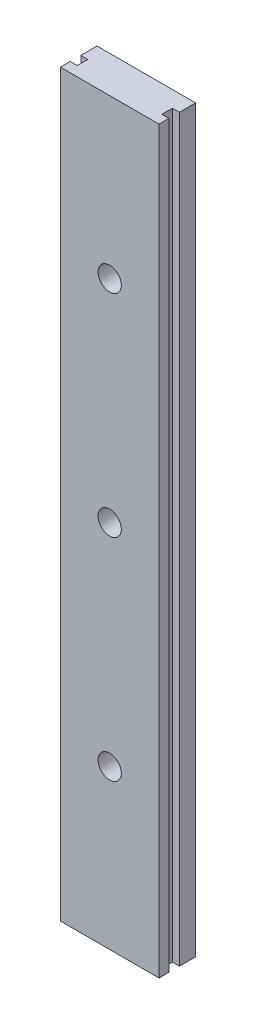
ISO-10303-21;
HEADER;
FILE_DESCRIPTION(('STEP AP214'),'2;1');
FILE_NAME('part.step','',(''),(''),'','','');
FILE_SCHEMA(('AUTOMOTIVE_DESIGN { 1 0 10303 214 1 1 1 1 }'));
ENDSEC;
DATA;
#1=APPLICATION_CONTEXT('core data for automotive mechanical design processes');
#2=APPLICATION_PROTOCOL_DEFINITION('international standard','automotive_design',2000,#1);
#3=PRODUCT_CONTEXT('',#1,'mechanical');
#4=PRODUCT('Part','Part','',(#3));
#5=PRODUCT_RELATED_PRODUCT_CATEGORY('part','',(#4));
#6=PRODUCT_DEFINITION_FORMATION('','',#4);
#7=PRODUCT_DEFINITION_CONTEXT('part definition',#1,'design');
#8=PRODUCT_DEFINITION('design','',#6,#7);
#9=PRODUCT_DEFINITION_SHAPE('','',#8);
#10=(LENGTH_UNIT() NAMED_UNIT(*) SI_UNIT(.MILLI.,.METRE.));
#11=(NAMED_UNIT(*) PLANE_ANGLE_UNIT() SI_UNIT($,.RADIAN.));
#12=(NAMED_UNIT(*) SI_UNIT($,.STERADIAN.) SOLID_ANGLE_UNIT());
#13=UNCERTAINTY_MEASURE_WITH_UNIT(LENGTH_MEASURE(1.E-05),#10,'distance_accuracy_value','');
#14=(GEOMETRIC_REPRESENTATION_CONTEXT(3) GLOBAL_UNCERTAINTY_ASSIGNED_CONTEXT((#13)) GLOBAL_UNIT_ASSIGNED_CONTEXT((#10,
#11,#12)) REPRESENTATION_CONTEXT('',''));
#15=CARTESIAN_POINT('',(0.,0.,0.));
#16=DIRECTION('',(0.,0.,1.));
#17=DIRECTION('',(1.,0.,0.));
#18=AXIS2_PLACEMENT_3D('',#15,#16,#17);
#19=CARTESIAN_POINT('',(0.,105.,0.));
#20=DIRECTION('',(0.,0.,-1.));
#21=DIRECTION('',(-1.,0.,0.));
#22=AXIS2_PLACEMENT_3D('',#19,#20,#21);
#23=PLANE('',#22);
#24=CARTESIAN_POINT('',(7.,22.5,0.));
#25=DIRECTION('',(0.,0.,-1.));
#26=DIRECTION('',(-1.,0.,0.));
#27=AXIS2_PLACEMENT_3D('',#24,#25,#26);
#28=CIRCLE('',#27,1.65);
#29=CARTESIAN_POINT('',(5.35,22.5,0.));
#30=VERTEX_POINT('',#29);
#31=EDGE_CURVE('E266',#30,#30,#28,.T.);
#32=ORIENTED_EDGE('',*,*,#31,.T.);
#33=EDGE_LOOP('',(#32));
#34=FACE_BOUND('',#33,.T.);
#35=CARTESIAN_POINT('',(7.,82.5,0.));
#36=DIRECTION('',(0.,0.,-1.));
#37=DIRECTION('',(-1.,0.,0.));
#38=AXIS2_PLACEMENT_3D('',#35,#36,#37);
#39=CIRCLE('',#38,1.65);
#40=CARTESIAN_POINT('',(5.35,82.5,0.));
#41=VERTEX_POINT('',#40);
#42=EDGE_CURVE('E270',#41,#41,#39,.T.);
#43=ORIENTED_EDGE('',*,*,#42,.T.);
#44=EDGE_LOOP('',(#43));
#45=FACE_BOUND('',#44,.T.);
#46=CARTESIAN_POINT('',(7.,52.5,0.));
#47=DIRECTION('',(0.,0.,-1.));
#48=DIRECTION('',(-1.,0.,0.));
#49=AXIS2_PLACEMENT_3D('',#46,#47,#48);
#50=CIRCLE('',#49,1.65);
#51=CARTESIAN_POINT('',(5.35,52.5,0.));
#52=VERTEX_POINT('',#51);
#53=EDGE_CURVE('E161',#52,#52,#50,.T.);
#54=ORIENTED_EDGE('',*,*,#53,.T.);
#55=EDGE_LOOP('',(#54));
#56=FACE_BOUND('',#55,.T.);
#57=DIRECTION('',(1.,0.,0.));
#58=VECTOR('',#57,1.);
#59=CARTESIAN_POINT('',(0.,0.,0.));
#60=LINE('',#59,#58);
#61=CARTESIAN_POINT('',(0.,0.,0.));
#62=VERTEX_POINT('',#61);
#63=CARTESIAN_POINT('',(14.,0.,0.));
#64=VERTEX_POINT('',#63);
#65=EDGE_CURVE('E157',#62,#64,#60,.T.);
#66=ORIENTED_EDGE('',*,*,#65,.T.);
#67=DIRECTION('',(0.,-1.,0.));
#68=VECTOR('',#67,1.);
#69=CARTESIAN_POINT('',(14.,105.,0.));
#70=LINE('',#69,#68);
#71=CARTESIAN_POINT('',(14.,105.,0.));
#72=VERTEX_POINT('',#71);
#73=EDGE_CURVE('E11',#72,#64,#70,.T.);
#74=ORIENTED_EDGE('',*,*,#73,.F.);
#75=DIRECTION('',(1.,0.,0.));
#76=VECTOR('',#75,1.);
#77=CARTESIAN_POINT('',(0.,105.,0.));
#78=LINE('',#77,#76);
#79=CARTESIAN_POINT('',(0.,105.,0.));
#80=VERTEX_POINT('',#79);
#81=EDGE_CURVE('E180',#80,#72,#78,.T.);
#82=ORIENTED_EDGE('',*,*,#81,.F.);
#83=DIRECTION('',(0.,-1.,0.));
#84=VECTOR('',#83,1.);
#85=CARTESIAN_POINT('',(0.,105.,0.));
#86=LINE('',#85,#84);
#87=EDGE_CURVE('E153',#80,#62,#86,.T.);
#88=ORIENTED_EDGE('',*,*,#87,.T.);
#89=EDGE_LOOP('',(#66,#74,#82,#88));
#90=FACE_BOUND('',#89,.T.);
#91=ADVANCED_FACE('F37',(#34,#45,#56,#90),#23,.F.);
#92=CARTESIAN_POINT('',(14.,105.,0.));
#93=DIRECTION('',(-1.,0.,0.));
#94=DIRECTION('',(0.,0.,1.));
#95=AXIS2_PLACEMENT_3D('',#92,#93,#94);
#96=PLANE('',#95);
#97=DIRECTION('',(0.,0.,-1.));
#98=VECTOR('',#97,1.);
#99=CARTESIAN_POINT('',(14.,0.,0.));
#100=LINE('',#99,#98);
#101=CARTESIAN_POINT('',(14.,0.,-1.4));
#102=VERTEX_POINT('',#101);
#103=EDGE_CURVE('E160',#64,#102,#100,.T.);
#104=ORIENTED_EDGE('',*,*,#103,.T.);
#105=DIRECTION('',(0.,-1.,0.));
#106=VECTOR('',#105,1.);
#107=CARTESIAN_POINT('',(14.,105.,-1.4));
#108=LINE('',#107,#106);
#109=CARTESIAN_POINT('',(14.,105.,-1.4));
#110=VERTEX_POINT('',#109);
#111=EDGE_CURVE('E45',#110,#102,#108,.T.);
#112=ORIENTED_EDGE('',*,*,#111,.F.);
#113=DIRECTION('',(0.,0.,-1.));
#114=VECTOR('',#113,1.);
#115=CARTESIAN_POINT('',(14.,105.,0.));
#116=LINE('',#115,#114);
#117=EDGE_CURVE('E108',#72,#110,#116,.T.);
#118=ORIENTED_EDGE('',*,*,#117,.F.);
#119=ORIENTED_EDGE('',*,*,#73,.T.);
#120=EDGE_LOOP('',(#104,#112,#118,#119));
#121=FACE_BOUND('',#120,.T.);
#122=ADVANCED_FACE('F258',(#121),#96,.F.);
#123=CARTESIAN_POINT('',(14.,105.,-1.4));
#124=DIRECTION('',(0.,0.,1.));
#125=DIRECTION('',(1.,0.,0.));
#126=AXIS2_PLACEMENT_3D('',#123,#124,#125);
#127=PLANE('',#126);
#128=DIRECTION('',(-1.,0.,0.));
#129=VECTOR('',#128,1.);
#130=CARTESIAN_POINT('',(14.,0.,-1.4));
#131=LINE('',#130,#129);
#132=CARTESIAN_POINT('',(13.,0.,-1.4));
#133=VERTEX_POINT('',#132);
#134=EDGE_CURVE('E163',#102,#133,#131,.T.);
#135=ORIENTED_EDGE('',*,*,#134,.T.);
#136=DIRECTION('',(0.,-1.,0.));
#137=VECTOR('',#136,1.);
#138=CARTESIAN_POINT('',(13.,105.,-1.4));
#139=LINE('',#138,#137);
#140=CARTESIAN_POINT('',(13.,105.,-1.4));
#141=VERTEX_POINT('',#140);
#142=EDGE_CURVE('E199',#141,#133,#139,.T.);
#143=ORIENTED_EDGE('',*,*,#142,.F.);
#144=DIRECTION('',(-1.,0.,0.));
#145=VECTOR('',#144,1.);
#146=CARTESIAN_POINT('',(14.,105.,-1.4));
#147=LINE('',#146,#145);
#148=EDGE_CURVE('E207',#110,#141,#147,.T.);
#149=ORIENTED_EDGE('',*,*,#148,.F.);
#150=ORIENTED_EDGE('',*,*,#111,.T.);
#151=EDGE_LOOP('',(#135,#143,#149,#150));
#152=FACE_BOUND('',#151,.T.);
#153=ADVANCED_FACE('F205',(#152),#127,.F.);
#154=CARTESIAN_POINT('',(13.,105.,-1.4));
#155=DIRECTION('',(-1.,0.,0.));
#156=DIRECTION('',(0.,0.,1.));
#157=AXIS2_PLACEMENT_3D('',#154,#155,#156);
#158=PLANE('',#157);
#159=DIRECTION('',(0.,0.,-1.));
#160=VECTOR('',#159,1.);
#161=CARTESIAN_POINT('',(13.,0.,-1.4));
#162=LINE('',#161,#160);
#163=CARTESIAN_POINT('',(13.,0.,-2.9));
#164=VERTEX_POINT('',#163);
#165=EDGE_CURVE('E165',#133,#164,#162,.T.);
#166=ORIENTED_EDGE('',*,*,#165,.T.);
#167=DIRECTION('',(0.,-1.,0.));
#168=VECTOR('',#167,1.);
#169=CARTESIAN_POINT('',(13.,105.,-2.9));
#170=LINE('',#169,#168);
#171=CARTESIAN_POINT('',(13.,105.,-2.9));
#172=VERTEX_POINT('',#171);
#173=EDGE_CURVE('E196',#172,#164,#170,.T.);
#174=ORIENTED_EDGE('',*,*,#173,.F.);
#175=DIRECTION('',(0.,0.,-1.));
#176=VECTOR('',#175,1.);
#177=CARTESIAN_POINT('',(13.,105.,-1.4));
#178=LINE('',#177,#176);
#179=EDGE_CURVE('E225',#141,#172,#178,.T.);
#180=ORIENTED_EDGE('',*,*,#179,.F.);
#181=ORIENTED_EDGE('',*,*,#142,.T.);
#182=EDGE_LOOP('',(#166,#174,#180,#181));
#183=FACE_BOUND('',#182,.T.);
#184=ADVANCED_FACE('F216',(#183),#158,.F.);
#185=CARTESIAN_POINT('',(13.,105.,-2.9));
#186=DIRECTION('',(0.,0.,-1.));
#187=DIRECTION('',(-1.,0.,0.));
#188=AXIS2_PLACEMENT_3D('',#185,#186,#187);
#189=PLANE('',#188);
#190=DIRECTION('',(1.,0.,0.));
#191=VECTOR('',#190,1.);
#192=CARTESIAN_POINT('',(13.,0.,-2.9));
#193=LINE('',#192,#191);
#194=CARTESIAN_POINT('',(14.,0.,-2.9));
#195=VERTEX_POINT('',#194);
#196=EDGE_CURVE('E167',#164,#195,#193,.T.);
#197=ORIENTED_EDGE('',*,*,#196,.T.);
#198=DIRECTION('',(0.,-1.,0.));
#199=VECTOR('',#198,1.);
#200=CARTESIAN_POINT('',(14.,105.,-2.9));
#201=LINE('',#200,#199);
#202=CARTESIAN_POINT('',(14.,105.,-2.9));
#203=VERTEX_POINT('',#202);
#204=EDGE_CURVE('E193',#203,#195,#201,.T.);
#205=ORIENTED_EDGE('',*,*,#204,.F.);
#206=DIRECTION('',(1.,0.,0.));
#207=VECTOR('',#206,1.);
#208=CARTESIAN_POINT('',(13.,105.,-2.9));
#209=LINE('',#208,#207);
#210=EDGE_CURVE('E222',#172,#203,#209,.T.);
#211=ORIENTED_EDGE('',*,*,#210,.F.);
#212=ORIENTED_EDGE('',*,*,#173,.T.);
#213=EDGE_LOOP('',(#197,#205,#211,#212));
#214=FACE_BOUND('',#213,.T.);
#215=ADVANCED_FACE('F220',(#214),#189,.F.);
#216=CARTESIAN_POINT('',(14.,105.,-2.9));
#217=DIRECTION('',(-1.,0.,0.));
#218=DIRECTION('',(0.,0.,1.));
#219=AXIS2_PLACEMENT_3D('',#216,#217,#218);
#220=PLANE('',#219);
#221=DIRECTION('',(0.,0.,-1.));
#222=VECTOR('',#221,1.);
#223=CARTESIAN_POINT('',(14.,0.,-2.9));
#224=LINE('',#223,#222);
#225=CARTESIAN_POINT('',(14.,0.,-5.2));
#226=VERTEX_POINT('',#225);
#227=EDGE_CURVE('E169',#195,#226,#224,.T.);
#228=ORIENTED_EDGE('',*,*,#227,.T.);
#229=DIRECTION('',(0.,-1.,0.));
#230=VECTOR('',#229,1.);
#231=CARTESIAN_POINT('',(14.,105.,-5.2));
#232=LINE('',#231,#230);
#233=CARTESIAN_POINT('',(14.,105.,-5.2));
#234=VERTEX_POINT('',#233);
#235=EDGE_CURVE('E190',#234,#226,#232,.T.);
#236=ORIENTED_EDGE('',*,*,#235,.F.);
#237=DIRECTION('',(0.,0.,-1.));
#238=VECTOR('',#237,1.);
#239=CARTESIAN_POINT('',(14.,105.,-2.9));
#240=LINE('',#239,#238);
#241=EDGE_CURVE('E224',#203,#234,#240,.T.);
#242=ORIENTED_EDGE('',*,*,#241,.F.);
#243=ORIENTED_EDGE('',*,*,#204,.T.);
#244=EDGE_LOOP('',(#228,#236,#242,#243));
#245=FACE_BOUND('',#244,.T.);
#246=ADVANCED_FACE('F295',(#245),#220,.F.);
#247=CARTESIAN_POINT('',(0.,105.,-5.2));
#248=DIRECTION('',(0.,0.,1.));
#249=DIRECTION('',(1.,0.,0.));
#250=AXIS2_PLACEMENT_3D('',#247,#248,#249);
#251=PLANE('',#250);
#252=CARTESIAN_POINT('',(7.,22.5,-5.2));
#253=DIRECTION('',(0.,0.,-1.));
#254=DIRECTION('',(-1.,0.,0.));
#255=AXIS2_PLACEMENT_3D('',#252,#253,#254);
#256=CIRCLE('',#255,1.65);
#257=CARTESIAN_POINT('',(5.35,22.5,-5.2));
#258=VERTEX_POINT('',#257);
#259=EDGE_CURVE('E279',#258,#258,#256,.T.);
#260=ORIENTED_EDGE('',*,*,#259,.F.);
#261=EDGE_LOOP('',(#260));
#262=FACE_BOUND('',#261,.T.);
#263=CARTESIAN_POINT('',(7.,82.5,-5.2));
#264=DIRECTION('',(0.,0.,-1.));
#265=DIRECTION('',(-1.,0.,0.));
#266=AXIS2_PLACEMENT_3D('',#263,#264,#265);
#267=CIRCLE('',#266,1.65);
#268=CARTESIAN_POINT('',(5.35,82.5,-5.2));
#269=VERTEX_POINT('',#268);
#270=EDGE_CURVE('E285',#269,#269,#267,.T.);
#271=ORIENTED_EDGE('',*,*,#270,.F.);
#272=EDGE_LOOP('',(#271));
#273=FACE_BOUND('',#272,.T.);
#274=CARTESIAN_POINT('',(7.,52.5,-5.2));
#275=DIRECTION('',(0.,0.,-1.));
#276=DIRECTION('',(-1.,0.,0.));
#277=AXIS2_PLACEMENT_3D('',#274,#275,#276);
#278=CIRCLE('',#277,1.65);
#279=CARTESIAN_POINT('',(5.35,52.5,-5.2));
#280=VERTEX_POINT('',#279);
#281=EDGE_CURVE('E274',#280,#280,#278,.T.);
#282=ORIENTED_EDGE('',*,*,#281,.F.);
#283=EDGE_LOOP('',(#282));
#284=FACE_BOUND('',#283,.T.);
#285=DIRECTION('',(-1.,0.,0.));
#286=VECTOR('',#285,1.);
#287=CARTESIAN_POINT('',(0.,0.,-5.2));
#288=LINE('',#287,#286);
#289=CARTESIAN_POINT('',(0.,0.,-5.2));
#290=VERTEX_POINT('',#289);
#291=EDGE_CURVE('E171',#226,#290,#288,.T.);
#292=ORIENTED_EDGE('',*,*,#291,.T.);
#293=DIRECTION('',(0.,-1.,0.));
#294=VECTOR('',#293,1.);
#295=CARTESIAN_POINT('',(0.,105.,-5.2));
#296=LINE('',#295,#294);
#297=CARTESIAN_POINT('',(0.,105.,-5.2));
#298=VERTEX_POINT('',#297);
#299=EDGE_CURVE('E187',#298,#290,#296,.T.);
#300=ORIENTED_EDGE('',*,*,#299,.F.);
#301=DIRECTION('',(-1.,0.,0.));
#302=VECTOR('',#301,1.);
#303=CARTESIAN_POINT('',(0.,105.,-5.2));
#304=LINE('',#303,#302);
#305=EDGE_CURVE('E227',#234,#298,#304,.T.);
#306=ORIENTED_EDGE('',*,*,#305,.F.);
#307=ORIENTED_EDGE('',*,*,#235,.T.);
#308=EDGE_LOOP('',(#292,#300,#306,#307));
#309=FACE_BOUND('',#308,.T.);
#310=ADVANCED_FACE('F292',(#262,#273,#284,#309),#251,.F.);
#311=CARTESIAN_POINT('',(0.,105.,-2.9));
#312=DIRECTION('',(1.,0.,0.));
#313=DIRECTION('',(0.,0.,-1.));
#314=AXIS2_PLACEMENT_3D('',#311,#312,#313);
#315=PLANE('',#314);
#316=DIRECTION('',(0.,0.,1.));
#317=VECTOR('',#316,1.);
#318=CARTESIAN_POINT('',(0.,0.,-2.9));
#319=LINE('',#318,#317);
#320=CARTESIAN_POINT('',(0.,0.,-2.9));
#321=VERTEX_POINT('',#320);
#322=EDGE_CURVE('E173',#290,#321,#319,.T.);
#323=ORIENTED_EDGE('',*,*,#322,.T.);
#324=DIRECTION('',(0.,-1.,0.));
#325=VECTOR('',#324,1.);
#326=CARTESIAN_POINT('',(0.,105.,-2.9));
#327=LINE('',#326,#325);
#328=CARTESIAN_POINT('',(0.,105.,-2.9));
#329=VERTEX_POINT('',#328);
#330=EDGE_CURVE('E184',#329,#321,#327,.T.);
#331=ORIENTED_EDGE('',*,*,#330,.F.);
#332=DIRECTION('',(0.,0.,1.));
#333=VECTOR('',#332,1.);
#334=CARTESIAN_POINT('',(0.,105.,-2.9));
#335=LINE('',#334,#333);
#336=EDGE_CURVE('E233',#298,#329,#335,.T.);
#337=ORIENTED_EDGE('',*,*,#336,.F.);
#338=ORIENTED_EDGE('',*,*,#299,.T.);
#339=EDGE_LOOP('',(#323,#331,#337,#338));
#340=FACE_BOUND('',#339,.T.);
#341=ADVANCED_FACE('F239',(#340),#315,.F.);
#342=CARTESIAN_POINT('',(1.,105.,-2.9));
#343=DIRECTION('',(0.,0.,-1.));
#344=DIRECTION('',(-1.,0.,0.));
#345=AXIS2_PLACEMENT_3D('',#342,#343,#344);
#346=PLANE('',#345);
#347=DIRECTION('',(1.,0.,0.));
#348=VECTOR('',#347,1.);
#349=CARTESIAN_POINT('',(1.,0.,-2.9));
#350=LINE('',#349,#348);
#351=CARTESIAN_POINT('',(1.,0.,-2.9));
#352=VERTEX_POINT('',#351);
#353=EDGE_CURVE('E175',#321,#352,#350,.T.);
#354=ORIENTED_EDGE('',*,*,#353,.T.);
#355=DIRECTION('',(0.,-1.,0.));
#356=VECTOR('',#355,1.);
#357=CARTESIAN_POINT('',(1.,105.,-2.9));
#358=LINE('',#357,#356);
#359=CARTESIAN_POINT('',(1.,105.,-2.9));
#360=VERTEX_POINT('',#359);
#361=EDGE_CURVE('E148',#360,#352,#358,.T.);
#362=ORIENTED_EDGE('',*,*,#361,.F.);
#363=DIRECTION('',(1.,0.,0.));
#364=VECTOR('',#363,1.);
#365=CARTESIAN_POINT('',(1.,105.,-2.9));
#366=LINE('',#365,#364);
#367=EDGE_CURVE('E139',#329,#360,#366,.T.);
#368=ORIENTED_EDGE('',*,*,#367,.F.);
#369=ORIENTED_EDGE('',*,*,#330,.T.);
#370=EDGE_LOOP('',(#354,#362,#368,#369));
#371=FACE_BOUND('',#370,.T.);
#372=ADVANCED_FACE('F243',(#371),#346,.F.);
#373=CARTESIAN_POINT('',(1.,105.,-1.4));
#374=DIRECTION('',(1.,0.,0.));
#375=DIRECTION('',(0.,0.,-1.));
#376=AXIS2_PLACEMENT_3D('',#373,#374,#375);
#377=PLANE('',#376);
#378=DIRECTION('',(0.,0.,1.));
#379=VECTOR('',#378,1.);
#380=CARTESIAN_POINT('',(1.,0.,-1.4));
#381=LINE('',#380,#379);
#382=CARTESIAN_POINT('',(1.,0.,-1.4));
#383=VERTEX_POINT('',#382);
#384=EDGE_CURVE('E147',#352,#383,#381,.T.);
#385=ORIENTED_EDGE('',*,*,#384,.T.);
#386=DIRECTION('',(0.,-1.,0.));
#387=VECTOR('',#386,1.);
#388=CARTESIAN_POINT('',(1.,105.,-1.4));
#389=LINE('',#388,#387);
#390=CARTESIAN_POINT('',(1.,105.,-1.4));
#391=VERTEX_POINT('',#390);
#392=EDGE_CURVE('E144',#391,#383,#389,.T.);
#393=ORIENTED_EDGE('',*,*,#392,.F.);
#394=DIRECTION('',(0.,0.,1.));
#395=VECTOR('',#394,1.);
#396=CARTESIAN_POINT('',(1.,105.,-1.4));
#397=LINE('',#396,#395);
#398=EDGE_CURVE('E133',#360,#391,#397,.T.);
#399=ORIENTED_EDGE('',*,*,#398,.F.);
#400=ORIENTED_EDGE('',*,*,#361,.T.);
#401=EDGE_LOOP('',(#385,#393,#399,#400));
#402=FACE_BOUND('',#401,.T.);
#403=ADVANCED_FACE('F145',(#402),#377,.F.);
#404=CARTESIAN_POINT('',(0.,105.,-1.4));
#405=DIRECTION('',(0.,0.,1.));
#406=DIRECTION('',(1.,0.,0.));
#407=AXIS2_PLACEMENT_3D('',#404,#405,#406);
#408=PLANE('',#407);
#409=DIRECTION('',(-1.,0.,0.));
#410=VECTOR('',#409,1.);
#411=CARTESIAN_POINT('',(0.,0.,-1.4));
#412=LINE('',#411,#410);
#413=CARTESIAN_POINT('',(0.,0.,-1.4));
#414=VERTEX_POINT('',#413);
#415=EDGE_CURVE('E94',#383,#414,#412,.T.);
#416=ORIENTED_EDGE('',*,*,#415,.T.);
#417=DIRECTION('',(0.,-1.,0.));
#418=VECTOR('',#417,1.);
#419=CARTESIAN_POINT('',(0.,105.,-1.4));
#420=LINE('',#419,#418);
#421=CARTESIAN_POINT('',(0.,105.,-1.4));
#422=VERTEX_POINT('',#421);
#423=EDGE_CURVE('E149',#422,#414,#420,.T.);
#424=ORIENTED_EDGE('',*,*,#423,.F.);
#425=DIRECTION('',(-1.,0.,0.));
#426=VECTOR('',#425,1.);
#427=CARTESIAN_POINT('',(0.,105.,-1.4));
#428=LINE('',#427,#426);
#429=EDGE_CURVE('E137',#391,#422,#428,.T.);
#430=ORIENTED_EDGE('',*,*,#429,.F.);
#431=ORIENTED_EDGE('',*,*,#392,.T.);
#432=EDGE_LOOP('',(#416,#424,#430,#431));
#433=FACE_BOUND('',#432,.T.);
#434=ADVANCED_FACE('F151',(#433),#408,.F.);
#435=CARTESIAN_POINT('',(0.,105.,0.));
#436=DIRECTION('',(1.,0.,0.));
#437=DIRECTION('',(0.,0.,-1.));
#438=AXIS2_PLACEMENT_3D('',#435,#436,#437);
#439=PLANE('',#438);
#440=DIRECTION('',(0.,0.,1.));
#441=VECTOR('',#440,1.);
#442=CARTESIAN_POINT('',(0.,0.,0.));
#443=LINE('',#442,#441);
#444=EDGE_CURVE('E100',#414,#62,#443,.T.);
#445=ORIENTED_EDGE('',*,*,#444,.T.);
#446=ORIENTED_EDGE('',*,*,#87,.F.);
#447=DIRECTION('',(0.,0.,1.));
#448=VECTOR('',#447,1.);
#449=CARTESIAN_POINT('',(0.,105.,0.));
#450=LINE('',#449,#448);
#451=EDGE_CURVE('E53',#422,#80,#450,.T.);
#452=ORIENTED_EDGE('',*,*,#451,.F.);
#453=ORIENTED_EDGE('',*,*,#423,.T.);
#454=EDGE_LOOP('',(#445,#446,#452,#453));
#455=FACE_BOUND('',#454,.T.);
#456=ADVANCED_FACE('F247',(#455),#439,.F.);
#457=CARTESIAN_POINT('',(0.,105.,0.));
#458=DIRECTION('',(0.,1.,0.));
#459=DIRECTION('',(0.,0.,1.));
#460=AXIS2_PLACEMENT_3D('',#457,#458,#459);
#461=PLANE('',#460);
#462=ORIENTED_EDGE('',*,*,#81,.T.);
#463=ORIENTED_EDGE('',*,*,#117,.T.);
#464=ORIENTED_EDGE('',*,*,#148,.T.);
#465=ORIENTED_EDGE('',*,*,#179,.T.);
#466=ORIENTED_EDGE('',*,*,#210,.T.);
#467=ORIENTED_EDGE('',*,*,#241,.T.);
#468=ORIENTED_EDGE('',*,*,#305,.T.);
#469=ORIENTED_EDGE('',*,*,#336,.T.);
#470=ORIENTED_EDGE('',*,*,#367,.T.);
#471=ORIENTED_EDGE('',*,*,#398,.T.);
#472=ORIENTED_EDGE('',*,*,#429,.T.);
#473=ORIENTED_EDGE('',*,*,#451,.T.);
#474=EDGE_LOOP('',(#462,#463,#464,#465,#466,#467,#468,#469,#470,#471,#472,#473));
#475=FACE_BOUND('',#474,.T.);
#476=ADVANCED_FACE('F135',(#475),#461,.T.);
#477=CARTESIAN_POINT('',(0.,0.,0.));
#478=DIRECTION('',(0.,1.,0.));
#479=DIRECTION('',(0.,0.,1.));
#480=AXIS2_PLACEMENT_3D('',#477,#478,#479);
#481=PLANE('',#480);
#482=ORIENTED_EDGE('',*,*,#65,.F.);
#483=ORIENTED_EDGE('',*,*,#444,.F.);
#484=ORIENTED_EDGE('',*,*,#415,.F.);
#485=ORIENTED_EDGE('',*,*,#384,.F.);
#486=ORIENTED_EDGE('',*,*,#353,.F.);
#487=ORIENTED_EDGE('',*,*,#322,.F.);
#488=ORIENTED_EDGE('',*,*,#291,.F.);
#489=ORIENTED_EDGE('',*,*,#227,.F.);
#490=ORIENTED_EDGE('',*,*,#196,.F.);
#491=ORIENTED_EDGE('',*,*,#165,.F.);
#492=ORIENTED_EDGE('',*,*,#134,.F.);
#493=ORIENTED_EDGE('',*,*,#103,.F.);
#494=EDGE_LOOP('',(#482,#483,#484,#485,#486,#487,#488,#489,#490,#491,#492,#493));
#495=FACE_BOUND('',#494,.T.);
#496=ADVANCED_FACE('F211',(#495),#481,.F.);
#497=CARTESIAN_POINT('',(7.,52.5,0.));
#498=DIRECTION('',(0.,0.,-1.));
#499=DIRECTION('',(-1.,0.,0.));
#500=AXIS2_PLACEMENT_3D('',#497,#498,#499);
#501=CYLINDRICAL_SURFACE('',#500,1.65);
#502=ORIENTED_EDGE('',*,*,#53,.F.);
#503=EDGE_LOOP('',(#502));
#504=FACE_BOUND('',#503,.T.);
#505=ORIENTED_EDGE('',*,*,#281,.T.);
#506=EDGE_LOOP('',(#505));
#507=FACE_BOUND('',#506,.T.);
#508=ADVANCED_FACE('F378',(#504,#507),#501,.F.);
#509=CARTESIAN_POINT('',(7.,82.5,0.));
#510=DIRECTION('',(0.,0.,-1.));
#511=DIRECTION('',(-1.,0.,0.));
#512=AXIS2_PLACEMENT_3D('',#509,#510,#511);
#513=CYLINDRICAL_SURFACE('',#512,1.65);
#514=ORIENTED_EDGE('',*,*,#42,.F.);
#515=EDGE_LOOP('',(#514));
#516=FACE_BOUND('',#515,.T.);
#517=ORIENTED_EDGE('',*,*,#270,.T.);
#518=EDGE_LOOP('',(#517));
#519=FACE_BOUND('',#518,.T.);
#520=ADVANCED_FACE('F290',(#516,#519),#513,.F.);
#521=CARTESIAN_POINT('',(7.,22.5,0.));
#522=DIRECTION('',(0.,0.,-1.));
#523=DIRECTION('',(-1.,0.,0.));
#524=AXIS2_PLACEMENT_3D('',#521,#522,#523);
#525=CYLINDRICAL_SURFACE('',#524,1.65);
#526=ORIENTED_EDGE('',*,*,#31,.F.);
#527=EDGE_LOOP('',(#526));
#528=FACE_BOUND('',#527,.T.);
#529=ORIENTED_EDGE('',*,*,#259,.T.);
#530=EDGE_LOOP('',(#529));
#531=FACE_BOUND('',#530,.T.);
#532=ADVANCED_FACE('F405',(#528,#531),#525,.F.);
#533=CLOSED_SHELL('',(#91,#122,#153,#184,#215,#246,#310,#341,#372,#403,#434,#456,#476,#496,#508,
#520,#532));
#534=MANIFOLD_SOLID_BREP('B2',#533);
#535=ADVANCED_BREP_SHAPE_REPRESENTATION('',(#18,#534),#14);
#536=SHAPE_DEFINITION_REPRESENTATION(#9,#535);
ENDSEC;
END-ISO-10303-21;
